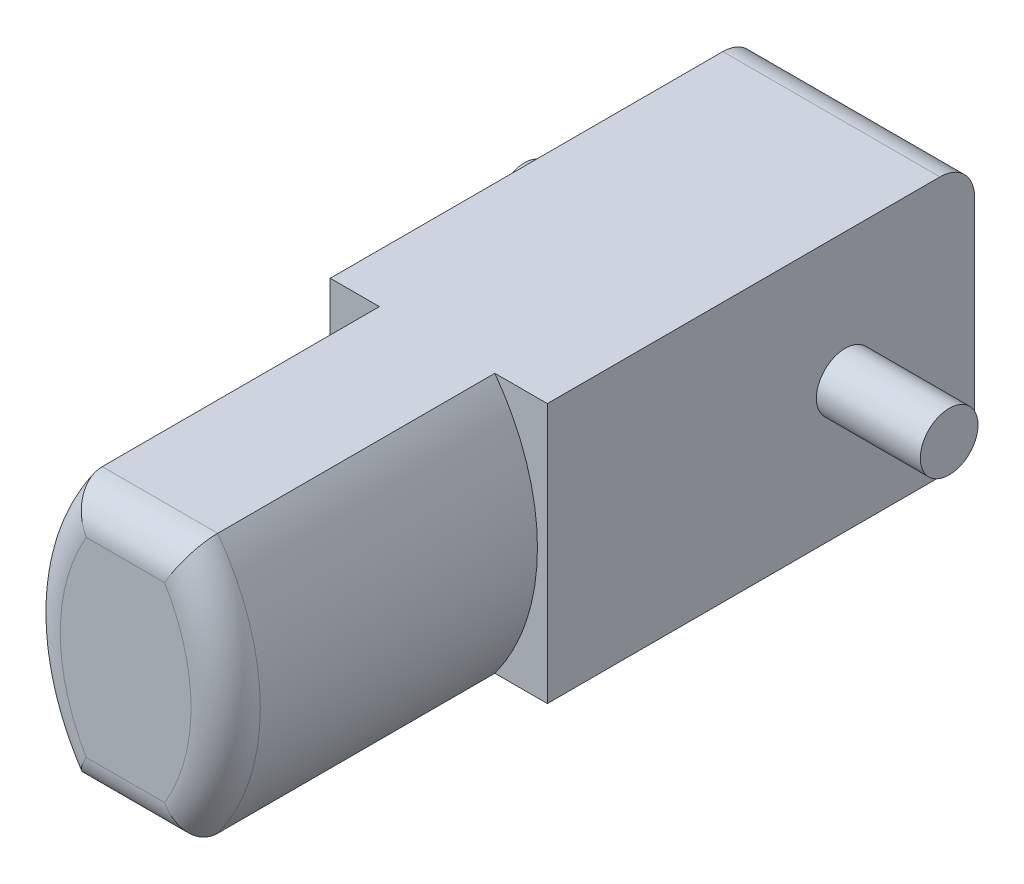
ISO-10303-21;
HEADER;
FILE_DESCRIPTION(('STEP AP214'),'2;1');
FILE_NAME('part.step','',(''),(''),'','','');
FILE_SCHEMA(('AUTOMOTIVE_DESIGN { 1 0 10303 214 1 1 1 1 }'));
ENDSEC;
DATA;
#1=APPLICATION_CONTEXT('core data for automotive mechanical design processes');
#2=APPLICATION_PROTOCOL_DEFINITION('international standard','automotive_design',2000,#1);
#3=PRODUCT_CONTEXT('',#1,'mechanical');
#4=PRODUCT('Part','Part','',(#3));
#5=PRODUCT_RELATED_PRODUCT_CATEGORY('part','',(#4));
#6=PRODUCT_DEFINITION_FORMATION('','',#4);
#7=PRODUCT_DEFINITION_CONTEXT('part definition',#1,'design');
#8=PRODUCT_DEFINITION('design','',#6,#7);
#9=PRODUCT_DEFINITION_SHAPE('','',#8);
#10=(LENGTH_UNIT() NAMED_UNIT(*) SI_UNIT(.MILLI.,.METRE.));
#11=(NAMED_UNIT(*) PLANE_ANGLE_UNIT() SI_UNIT($,.RADIAN.));
#12=(NAMED_UNIT(*) SI_UNIT($,.STERADIAN.) SOLID_ANGLE_UNIT());
#13=UNCERTAINTY_MEASURE_WITH_UNIT(LENGTH_MEASURE(1.E-05),#10,'distance_accuracy_value','');
#14=(GEOMETRIC_REPRESENTATION_CONTEXT(3) GLOBAL_UNCERTAINTY_ASSIGNED_CONTEXT((#13)) GLOBAL_UNIT_ASSIGNED_CONTEXT((#10,
#11,#12)) REPRESENTATION_CONTEXT('',''));
#15=CARTESIAN_POINT('',(0.,0.,0.));
#16=DIRECTION('',(0.,0.,1.));
#17=DIRECTION('',(1.,0.,0.));
#18=AXIS2_PLACEMENT_3D('',#15,#16,#17);
#19=CARTESIAN_POINT('',(0.,0.,37.));
#20=DIRECTION('',(0.,0.,1.));
#21=DIRECTION('',(1.,0.,0.));
#22=AXIS2_PLACEMENT_3D('',#19,#20,#21);
#23=PLANE('',#22);
#24=CARTESIAN_POINT('',(19.8648834599474,11.25,37.));
#25=DIRECTION('',(0.,0.,1.));
#26=DIRECTION('',(1.,0.,0.));
#27=AXIS2_PLACEMENT_3D('',#24,#25,#26);
#28=CIRCLE('',#27,19.2408791543178);
#29=CARTESIAN_POINT('',(4.25562560984243,22.5,37.));
#30=VERTEX_POINT('',#29);
#31=CARTESIAN_POINT('',(4.25562560984242,0.,37.));
#32=VERTEX_POINT('',#31);
#33=EDGE_CURVE('E157',#30,#32,#28,.T.);
#34=ORIENTED_EDGE('',*,*,#33,.F.);
#35=DIRECTION('',(1.,0.,0.));
#36=VECTOR('',#35,1.);
#37=CARTESIAN_POINT('',(0.,22.5,37.));
#38=LINE('',#37,#36);
#39=CARTESIAN_POINT('',(0.,22.5,37.));
#40=VERTEX_POINT('',#39);
#41=EDGE_CURVE('E152',#40,#30,#38,.T.);
#42=ORIENTED_EDGE('',*,*,#41,.F.);
#43=DIRECTION('',(0.,1.,0.));
#44=VECTOR('',#43,1.);
#45=CARTESIAN_POINT('',(0.,0.,37.));
#46=LINE('',#45,#44);
#47=CARTESIAN_POINT('',(0.,0.,37.));
#48=VERTEX_POINT('',#47);
#49=EDGE_CURVE('E185',#48,#40,#46,.T.);
#50=ORIENTED_EDGE('',*,*,#49,.F.);
#51=DIRECTION('',(1.,0.,0.));
#52=VECTOR('',#51,1.);
#53=CARTESIAN_POINT('',(0.,0.,37.));
#54=LINE('',#53,#52);
#55=EDGE_CURVE('E181',#48,#32,#54,.T.);
#56=ORIENTED_EDGE('',*,*,#55,.T.);
#57=EDGE_LOOP('',(#34,#42,#50,#56));
#58=FACE_BOUND('',#57,.T.);
#59=ADVANCED_FACE('F41',(#58),#23,.T.);
#60=CARTESIAN_POINT('',(0.,22.5,37.));
#61=DIRECTION('',(0.,1.,0.));
#62=DIRECTION('',(0.,0.,1.));
#63=AXIS2_PLACEMENT_3D('',#60,#61,#62);
#64=PLANE('',#63);
#65=DIRECTION('',(0.,0.,-1.));
#66=VECTOR('',#65,1.);
#67=CARTESIAN_POINT('',(4.25562560984243,22.5,64.));
#68=LINE('',#67,#66);
#69=CARTESIAN_POINT('',(4.25562560984243,22.5,61.));
#70=VERTEX_POINT('',#69);
#71=EDGE_CURVE('E141',#70,#30,#68,.T.);
#72=ORIENTED_EDGE('',*,*,#71,.F.);
#73=DIRECTION('',(-1.,0.,0.));
#74=VECTOR('',#73,1.);
#75=CARTESIAN_POINT('',(0.,22.5,61.));
#76=LINE('',#75,#74);
#77=CARTESIAN_POINT('',(14.2556256098424,22.5,61.));
#78=VERTEX_POINT('',#77);
#79=EDGE_CURVE('E68',#70,#78,#76,.F.);
#80=ORIENTED_EDGE('',*,*,#79,.T.);
#81=DIRECTION('',(0.,0.,-1.));
#82=VECTOR('',#81,1.);
#83=CARTESIAN_POINT('',(14.2556256098424,22.5,64.));
#84=LINE('',#83,#82);
#85=CARTESIAN_POINT('',(14.2556256098424,22.5,37.));
#86=VERTEX_POINT('',#85);
#87=EDGE_CURVE('E132',#78,#86,#84,.T.);
#88=ORIENTED_EDGE('',*,*,#87,.T.);
#89=CARTESIAN_POINT('',(18.8,22.5,37.));
#90=VERTEX_POINT('',#89);
#91=EDGE_CURVE('E136',#86,#90,#38,.T.);
#92=ORIENTED_EDGE('',*,*,#91,.T.);
#93=DIRECTION('',(0.,0.,-1.));
#94=VECTOR('',#93,1.);
#95=CARTESIAN_POINT('',(18.8,22.5,37.));
#96=LINE('',#95,#94);
#97=CARTESIAN_POINT('',(18.8,22.5,3.));
#98=VERTEX_POINT('',#97);
#99=EDGE_CURVE('E189',#90,#98,#96,.T.);
#100=ORIENTED_EDGE('',*,*,#99,.T.);
#101=DIRECTION('',(1.,0.,0.));
#102=VECTOR('',#101,1.);
#103=CARTESIAN_POINT('',(0.,22.5,3.));
#104=LINE('',#103,#102);
#105=CARTESIAN_POINT('',(0.,22.5,3.));
#106=VERTEX_POINT('',#105);
#107=EDGE_CURVE('E233',#98,#106,#104,.F.);
#108=ORIENTED_EDGE('',*,*,#107,.T.);
#109=DIRECTION('',(0.,0.,-1.));
#110=VECTOR('',#109,1.);
#111=CARTESIAN_POINT('',(0.,22.5,37.));
#112=LINE('',#111,#110);
#113=EDGE_CURVE('E196',#40,#106,#112,.T.);
#114=ORIENTED_EDGE('',*,*,#113,.F.);
#115=ORIENTED_EDGE('',*,*,#41,.T.);
#116=EDGE_LOOP('',(#72,#80,#88,#92,#100,#108,#114,#115));
#117=FACE_BOUND('',#116,.T.);
#118=ADVANCED_FACE('F134',(#117),#64,.T.);
#119=CARTESIAN_POINT('',(0.,0.,37.));
#120=DIRECTION('',(-1.,0.,0.));
#121=DIRECTION('',(0.,0.,1.));
#122=AXIS2_PLACEMENT_3D('',#119,#120,#121);
#123=PLANE('',#122);
#124=CARTESIAN_POINT('',(0.,11.25,11.2));
#125=DIRECTION('',(-1.,0.,0.));
#126=DIRECTION('',(0.,0.,1.));
#127=AXIS2_PLACEMENT_3D('',#124,#125,#126);
#128=CIRCLE('',#127,2.5);
#129=CARTESIAN_POINT('',(0.,11.25,13.7));
#130=VERTEX_POINT('',#129);
#131=EDGE_CURVE('E11',#130,#130,#128,.T.);
#132=ORIENTED_EDGE('',*,*,#131,.F.);
#133=EDGE_LOOP('',(#132));
#134=FACE_BOUND('',#133,.T.);
#135=DIRECTION('',(0.,1.,0.));
#136=VECTOR('',#135,1.);
#137=CARTESIAN_POINT('',(0.,0.,0.));
#138=LINE('',#137,#136);
#139=CARTESIAN_POINT('',(0.,3.,0.));
#140=VERTEX_POINT('',#139);
#141=CARTESIAN_POINT('',(0.,19.5,0.));
#142=VERTEX_POINT('',#141);
#143=EDGE_CURVE('E153',#140,#142,#138,.T.);
#144=ORIENTED_EDGE('',*,*,#143,.F.);
#145=CARTESIAN_POINT('',(0.,3.,3.));
#146=DIRECTION('',(-1.,0.,0.));
#147=DIRECTION('',(0.,0.,1.));
#148=AXIS2_PLACEMENT_3D('',#145,#146,#147);
#149=CIRCLE('',#148,3.);
#150=CARTESIAN_POINT('',(0.,0.,3.));
#151=VERTEX_POINT('',#150);
#152=EDGE_CURVE('E230',#140,#151,#149,.T.);
#153=ORIENTED_EDGE('',*,*,#152,.T.);
#154=DIRECTION('',(0.,0.,-1.));
#155=VECTOR('',#154,1.);
#156=CARTESIAN_POINT('',(0.,0.,37.));
#157=LINE('',#156,#155);
#158=EDGE_CURVE('E201',#48,#151,#157,.T.);
#159=ORIENTED_EDGE('',*,*,#158,.F.);
#160=ORIENTED_EDGE('',*,*,#49,.T.);
#161=ORIENTED_EDGE('',*,*,#113,.T.);
#162=CARTESIAN_POINT('',(0.,19.5,3.));
#163=DIRECTION('',(-1.,0.,0.));
#164=DIRECTION('',(0.,0.,1.));
#165=AXIS2_PLACEMENT_3D('',#162,#163,#164);
#166=CIRCLE('',#165,3.);
#167=EDGE_CURVE('E227',#106,#142,#166,.T.);
#168=ORIENTED_EDGE('',*,*,#167,.T.);
#169=EDGE_LOOP('',(#144,#153,#159,#160,#161,#168));
#170=FACE_BOUND('',#169,.T.);
#171=ADVANCED_FACE('F315',(#134,#170),#123,.T.);
#172=CARTESIAN_POINT('',(0.,0.,37.));
#173=DIRECTION('',(0.,1.,0.));
#174=DIRECTION('',(0.,0.,1.));
#175=AXIS2_PLACEMENT_3D('',#172,#173,#174);
#176=PLANE('',#175);
#177=DIRECTION('',(0.,0.,-1.));
#178=VECTOR('',#177,1.);
#179=CARTESIAN_POINT('',(14.2556256098424,0.,64.));
#180=LINE('',#179,#178);
#181=CARTESIAN_POINT('',(14.2556256098424,0.,61.));
#182=VERTEX_POINT('',#181);
#183=CARTESIAN_POINT('',(14.2556256098424,0.,37.));
#184=VERTEX_POINT('',#183);
#185=EDGE_CURVE('E140',#182,#184,#180,.T.);
#186=ORIENTED_EDGE('',*,*,#185,.F.);
#187=DIRECTION('',(1.,0.,0.));
#188=VECTOR('',#187,1.);
#189=CARTESIAN_POINT('',(4.25562560984243,0.,61.));
#190=LINE('',#189,#188);
#191=CARTESIAN_POINT('',(4.25562560984243,0.,61.));
#192=VERTEX_POINT('',#191);
#193=EDGE_CURVE('E52',#182,#192,#190,.F.);
#194=ORIENTED_EDGE('',*,*,#193,.T.);
#195=DIRECTION('',(0.,0.,-1.));
#196=VECTOR('',#195,1.);
#197=CARTESIAN_POINT('',(4.25562560984243,0.,64.));
#198=LINE('',#197,#196);
#199=EDGE_CURVE('E163',#192,#32,#198,.T.);
#200=ORIENTED_EDGE('',*,*,#199,.T.);
#201=ORIENTED_EDGE('',*,*,#55,.F.);
#202=ORIENTED_EDGE('',*,*,#158,.T.);
#203=DIRECTION('',(1.,0.,0.));
#204=VECTOR('',#203,1.);
#205=CARTESIAN_POINT('',(0.,0.,3.));
#206=LINE('',#205,#204);
#207=CARTESIAN_POINT('',(18.8,0.,3.));
#208=VERTEX_POINT('',#207);
#209=EDGE_CURVE('E200',#151,#208,#206,.T.);
#210=ORIENTED_EDGE('',*,*,#209,.T.);
#211=DIRECTION('',(0.,0.,-1.));
#212=VECTOR('',#211,1.);
#213=CARTESIAN_POINT('',(18.8,0.,37.));
#214=LINE('',#213,#212);
#215=CARTESIAN_POINT('',(18.8,0.,37.));
#216=VERTEX_POINT('',#215);
#217=EDGE_CURVE('E205',#216,#208,#214,.T.);
#218=ORIENTED_EDGE('',*,*,#217,.F.);
#219=EDGE_CURVE('E180',#184,#216,#54,.T.);
#220=ORIENTED_EDGE('',*,*,#219,.F.);
#221=EDGE_LOOP('',(#186,#194,#200,#201,#202,#210,#218,#220));
#222=FACE_BOUND('',#221,.T.);
#223=ADVANCED_FACE('F321',(#222),#176,.F.);
#224=CARTESIAN_POINT('',(18.8,0.,37.));
#225=DIRECTION('',(-1.,0.,0.));
#226=DIRECTION('',(0.,0.,1.));
#227=AXIS2_PLACEMENT_3D('',#224,#225,#226);
#228=PLANE('',#227);
#229=CARTESIAN_POINT('',(18.8,11.25,11.2));
#230=DIRECTION('',(-1.,0.,0.));
#231=DIRECTION('',(0.,0.,1.));
#232=AXIS2_PLACEMENT_3D('',#229,#230,#231);
#233=CIRCLE('',#232,2.5);
#234=CARTESIAN_POINT('',(18.8,11.25,13.7));
#235=VERTEX_POINT('',#234);
#236=EDGE_CURVE('E46',#235,#235,#233,.T.);
#237=ORIENTED_EDGE('',*,*,#236,.T.);
#238=EDGE_LOOP('',(#237));
#239=FACE_BOUND('',#238,.T.);
#240=ORIENTED_EDGE('',*,*,#217,.T.);
#241=CARTESIAN_POINT('',(18.8,3.,3.));
#242=DIRECTION('',(-1.,0.,0.));
#243=DIRECTION('',(0.,0.,1.));
#244=AXIS2_PLACEMENT_3D('',#241,#242,#243);
#245=CIRCLE('',#244,3.);
#246=CARTESIAN_POINT('',(18.8,3.,0.));
#247=VERTEX_POINT('',#246);
#248=EDGE_CURVE('E217',#208,#247,#245,.F.);
#249=ORIENTED_EDGE('',*,*,#248,.T.);
#250=DIRECTION('',(0.,1.,0.));
#251=VECTOR('',#250,1.);
#252=CARTESIAN_POINT('',(18.8,0.,0.));
#253=LINE('',#252,#251);
#254=CARTESIAN_POINT('',(18.8,19.5,0.));
#255=VERTEX_POINT('',#254);
#256=EDGE_CURVE('E174',#247,#255,#253,.T.);
#257=ORIENTED_EDGE('',*,*,#256,.T.);
#258=CARTESIAN_POINT('',(18.8,19.5,3.));
#259=DIRECTION('',(-1.,0.,0.));
#260=DIRECTION('',(0.,0.,1.));
#261=AXIS2_PLACEMENT_3D('',#258,#259,#260);
#262=CIRCLE('',#261,3.);
#263=EDGE_CURVE('E214',#255,#98,#262,.F.);
#264=ORIENTED_EDGE('',*,*,#263,.T.);
#265=ORIENTED_EDGE('',*,*,#99,.F.);
#266=DIRECTION('',(0.,1.,0.));
#267=VECTOR('',#266,1.);
#268=CARTESIAN_POINT('',(18.8,0.,37.));
#269=LINE('',#268,#267);
#270=EDGE_CURVE('E149',#216,#90,#269,.T.);
#271=ORIENTED_EDGE('',*,*,#270,.F.);
#272=EDGE_LOOP('',(#240,#249,#257,#264,#265,#271));
#273=FACE_BOUND('',#272,.T.);
#274=ADVANCED_FACE('F342',(#239,#273),#228,.F.);
#275=CARTESIAN_POINT('',(-1.06,11.25,37.));
#276=DIRECTION('',(0.,0.,1.));
#277=DIRECTION('',(1.,0.,0.));
#278=AXIS2_PLACEMENT_3D('',#275,#276,#277);
#279=CIRCLE('',#278,19.0034441041844);
#280=EDGE_CURVE('E146',#184,#86,#279,.T.);
#281=ORIENTED_EDGE('',*,*,#280,.F.);
#282=ORIENTED_EDGE('',*,*,#219,.T.);
#283=ORIENTED_EDGE('',*,*,#270,.T.);
#284=ORIENTED_EDGE('',*,*,#91,.F.);
#285=EDGE_LOOP('',(#281,#282,#283,#284));
#286=FACE_BOUND('',#285,.T.);
#287=ADVANCED_FACE('F145',(#286),#23,.T.);
#288=CARTESIAN_POINT('',(0.,0.,0.));
#289=DIRECTION('',(0.,0.,1.));
#290=DIRECTION('',(1.,0.,0.));
#291=AXIS2_PLACEMENT_3D('',#288,#289,#290);
#292=PLANE('',#291);
#293=ORIENTED_EDGE('',*,*,#256,.F.);
#294=DIRECTION('',(1.,0.,0.));
#295=VECTOR('',#294,1.);
#296=CARTESIAN_POINT('',(0.,3.,0.));
#297=LINE('',#296,#295);
#298=EDGE_CURVE('E224',#247,#140,#297,.F.);
#299=ORIENTED_EDGE('',*,*,#298,.T.);
#300=ORIENTED_EDGE('',*,*,#143,.T.);
#301=DIRECTION('',(1.,0.,0.));
#302=VECTOR('',#301,1.);
#303=CARTESIAN_POINT('',(18.8,19.5,0.));
#304=LINE('',#303,#302);
#305=EDGE_CURVE('E220',#142,#255,#304,.T.);
#306=ORIENTED_EDGE('',*,*,#305,.T.);
#307=EDGE_LOOP('',(#293,#299,#300,#306));
#308=FACE_BOUND('',#307,.T.);
#309=ADVANCED_FACE('F341',(#308),#292,.F.);
#310=CARTESIAN_POINT('',(0.,3.,3.));
#311=DIRECTION('',(1.,0.,0.));
#312=DIRECTION('',(0.,0.,-1.));
#313=AXIS2_PLACEMENT_3D('',#310,#311,#312);
#314=CYLINDRICAL_SURFACE('',#313,3.);
#315=ORIENTED_EDGE('',*,*,#152,.F.);
#316=ORIENTED_EDGE('',*,*,#298,.F.);
#317=ORIENTED_EDGE('',*,*,#248,.F.);
#318=ORIENTED_EDGE('',*,*,#209,.F.);
#319=EDGE_LOOP('',(#315,#316,#317,#318));
#320=FACE_BOUND('',#319,.T.);
#321=ADVANCED_FACE('F347',(#320),#314,.T.);
#322=CARTESIAN_POINT('',(0.,19.5,3.));
#323=DIRECTION('',(-1.,0.,0.));
#324=DIRECTION('',(0.,0.,1.));
#325=AXIS2_PLACEMENT_3D('',#322,#323,#324);
#326=CYLINDRICAL_SURFACE('',#325,3.);
#327=ORIENTED_EDGE('',*,*,#167,.F.);
#328=ORIENTED_EDGE('',*,*,#107,.F.);
#329=ORIENTED_EDGE('',*,*,#263,.F.);
#330=ORIENTED_EDGE('',*,*,#305,.F.);
#331=EDGE_LOOP('',(#327,#328,#329,#330));
#332=FACE_BOUND('',#331,.T.);
#333=ADVANCED_FACE('F362',(#332),#326,.T.);
#334=CARTESIAN_POINT('',(-1.06,11.25,64.));
#335=DIRECTION('',(0.,0.,-1.));
#336=DIRECTION('',(-1.,0.,0.));
#337=AXIS2_PLACEMENT_3D('',#334,#335,#336);
#338=CYLINDRICAL_SURFACE('',#337,19.0034441041844);
#339=ORIENTED_EDGE('',*,*,#87,.F.);
#340=CARTESIAN_POINT('',(-1.06,11.25,61.));
#341=DIRECTION('',(0.,0.,1.));
#342=DIRECTION('',(1.,0.,0.));
#343=AXIS2_PLACEMENT_3D('',#340,#341,#342);
#344=CIRCLE('',#343,19.0034441041844);
#345=EDGE_CURVE('E60',#78,#182,#344,.F.);
#346=ORIENTED_EDGE('',*,*,#345,.T.);
#347=ORIENTED_EDGE('',*,*,#185,.T.);
#348=ORIENTED_EDGE('',*,*,#280,.T.);
#349=EDGE_LOOP('',(#339,#346,#347,#348));
#350=FACE_BOUND('',#349,.T.);
#351=ADVANCED_FACE('F155',(#350),#338,.T.);
#352=CARTESIAN_POINT('',(19.8648834599474,11.25,64.));
#353=DIRECTION('',(0.,0.,-1.));
#354=DIRECTION('',(-1.,0.,0.));
#355=AXIS2_PLACEMENT_3D('',#352,#353,#354);
#356=CYLINDRICAL_SURFACE('',#355,19.2408791543178);
#357=ORIENTED_EDGE('',*,*,#199,.F.);
#358=CARTESIAN_POINT('',(19.8648834599474,11.25,61.));
#359=DIRECTION('',(0.,0.,1.));
#360=DIRECTION('',(1.,0.,0.));
#361=AXIS2_PLACEMENT_3D('',#358,#359,#360);
#362=CIRCLE('',#361,19.2408791543178);
#363=EDGE_CURVE('E249',#192,#70,#362,.F.);
#364=ORIENTED_EDGE('',*,*,#363,.T.);
#365=ORIENTED_EDGE('',*,*,#71,.T.);
#366=ORIENTED_EDGE('',*,*,#33,.T.);
#367=EDGE_LOOP('',(#357,#364,#365,#366));
#368=FACE_BOUND('',#367,.T.);
#369=ADVANCED_FACE('F308',(#368),#356,.T.);
#370=CARTESIAN_POINT('',(0.,0.,64.));
#371=DIRECTION('',(0.,0.,1.));
#372=DIRECTION('',(1.,0.,0.));
#373=AXIS2_PLACEMENT_3D('',#370,#371,#372);
#374=PLANE('',#373);
#375=DIRECTION('',(-1.,0.,0.));
#376=VECTOR('',#375,1.);
#377=CARTESIAN_POINT('',(0.,19.5,64.));
#378=LINE('',#377,#376);
#379=CARTESIAN_POINT('',(12.6530493762604,19.5,64.));
#380=VERTEX_POINT('',#379);
#381=CARTESIAN_POINT('',(5.8754711883344,19.5,64.));
#382=VERTEX_POINT('',#381);
#383=EDGE_CURVE('E242',#380,#382,#378,.T.);
#384=ORIENTED_EDGE('',*,*,#383,.T.);
#385=CARTESIAN_POINT('',(19.8648834599474,11.25,64.));
#386=DIRECTION('',(0.,0.,1.));
#387=DIRECTION('',(1.,0.,0.));
#388=AXIS2_PLACEMENT_3D('',#385,#386,#387);
#389=CIRCLE('',#388,16.2408791543178);
#390=CARTESIAN_POINT('',(5.87547118833439,3.,64.));
#391=VERTEX_POINT('',#390);
#392=EDGE_CURVE('E245',#382,#391,#389,.T.);
#393=ORIENTED_EDGE('',*,*,#392,.T.);
#394=DIRECTION('',(1.,0.,0.));
#395=VECTOR('',#394,1.);
#396=CARTESIAN_POINT('',(14.2556256098424,3.,64.));
#397=LINE('',#396,#395);
#398=CARTESIAN_POINT('',(12.6530493762604,3.,64.));
#399=VERTEX_POINT('',#398);
#400=EDGE_CURVE('E236',#391,#399,#397,.T.);
#401=ORIENTED_EDGE('',*,*,#400,.T.);
#402=CARTESIAN_POINT('',(-1.06,11.25,64.));
#403=DIRECTION('',(0.,0.,1.));
#404=DIRECTION('',(1.,0.,0.));
#405=AXIS2_PLACEMENT_3D('',#402,#403,#404);
#406=CIRCLE('',#405,16.0034441041844);
#407=EDGE_CURVE('E239',#399,#380,#406,.T.);
#408=ORIENTED_EDGE('',*,*,#407,.T.);
#409=EDGE_LOOP('',(#384,#393,#401,#408));
#410=FACE_BOUND('',#409,.T.);
#411=ADVANCED_FACE('F324',(#410),#374,.T.);
#412=CARTESIAN_POINT('',(-1.06,11.25,61.));
#413=DIRECTION('',(0.,0.,1.));
#414=DIRECTION('',(1.,0.,0.));
#415=AXIS2_PLACEMENT_3D('',#412,#413,#414);
#416=TOROIDAL_SURFACE('',#415,16.0034441041844,3.);
#417=CARTESIAN_POINT('',(14.2556256098424,0.,61.));
#418=CARTESIAN_POINT('',(14.2556307993696,-1.21297341909825E-05,61.0776926413416));
#419=CARTESIAN_POINT('',(14.2540978443711,0.00301779681776747,61.1553788452683));
#420=CARTESIAN_POINT('',(14.2479957241066,0.0150689000052142,61.3101458514865));
#421=CARTESIAN_POINT('',(14.2434273328152,0.0240885493827637,61.3872268030369));
#422=CARTESIAN_POINT('',(14.2313150884543,0.0479854684127316,61.5399698340952));
#423=CARTESIAN_POINT('',(14.2237814450587,0.062842638563725,61.615635858689));
#424=CARTESIAN_POINT('',(14.2058211832511,0.0982254774250978,61.7652603917151));
#425=CARTESIAN_POINT('',(14.1953944850646,0.118751302445827,61.8392188530011));
#426=CARTESIAN_POINT('',(14.1599239338524,0.188488464012582,62.057685671185));
#427=CARTESIAN_POINT('',(14.1306718858884,0.245894662372869,62.1990059766847));
#428=CARTESIAN_POINT('',(14.0620102798178,0.380112662085482,62.4693648353754));
#429=CARTESIAN_POINT('',(14.0225949320598,0.456935523888903,62.5983963305306));
#430=CARTESIAN_POINT('',(13.9330775017135,0.630564469589995,62.8465097701834));
#431=CARTESIAN_POINT('',(13.8826096897179,0.728049398600006,62.9649837106666));
#432=CARTESIAN_POINT('',(13.7735029677644,0.937554480181293,63.1838727918787));
#433=CARTESIAN_POINT('',(13.7148619467342,1.04957838753399,63.2842832515619));
#434=CARTESIAN_POINT('',(13.584552566453,1.29685108624483,63.4750915883673));
#435=CARTESIAN_POINT('',(13.5121660029228,1.43330313228789,63.5634369997369));
#436=CARTESIAN_POINT('',(13.3610242297621,1.71589321539271,63.7160439012035));
#437=CARTESIAN_POINT('',(13.2822634302059,1.86203973337609,63.7802839675589));
#438=CARTESIAN_POINT('',(13.1147002976281,2.1702444514005,63.8878910356783));
#439=CARTESIAN_POINT('',(13.0255786953911,2.3327129987171,63.9295737162172));
#440=CARTESIAN_POINT('',(12.8441257279046,2.66022934922854,63.985308793218));
#441=CARTESIAN_POINT('',(12.7518012546713,2.82527123891318,63.9994171760891));
#442=CARTESIAN_POINT('',(12.6569319874604,2.99313233618418,63.9999941152385));
#443=CARTESIAN_POINT('',(12.6549908086265,2.99656631164993,64.0000000107584));
#444=CARTESIAN_POINT('',(12.6530493762604,3.,64.));
#445=B_SPLINE_CURVE_WITH_KNOTS('',3,(#417,#418,#419,#420,#421,#422,#423,#424,#425,#426,#427,
#428,#429,#430,#431,#432,#433,#434,#435,#436,#437,#438,#439,#440,#441,#442,#443,#444),
.UNSPECIFIED.,.F.,.F.,(4,2,2,2,2,2,2,2,2,2,2,2,2,4),(0.,0.232992848978928,0.465926312301886,
0.698064680157776,0.930209449753395,1.3938355088807,1.85772626417287,2.34025428793064,
2.82290717644436,3.35457687724048,3.88671798912587,4.4544665593535,5.02106117957321,
5.03289515923986),.UNSPECIFIED.);
#446=EDGE_CURVE('E166',#182,#399,#445,.T.);
#447=ORIENTED_EDGE('',*,*,#446,.F.);
#448=ORIENTED_EDGE('',*,*,#345,.F.);
#449=CARTESIAN_POINT('',(14.2556256098424,22.5,61.));
#450=CARTESIAN_POINT('',(14.2556307993696,22.5000121297342,61.0776926413416));
#451=CARTESIAN_POINT('',(14.2540978443711,22.4969822031822,61.1553788452683));
#452=CARTESIAN_POINT('',(14.2479957241066,22.4849310999948,61.3101458514865));
#453=CARTESIAN_POINT('',(14.2434273328152,22.4759114506172,61.3872268030369));
#454=CARTESIAN_POINT('',(14.2313150884542,22.4520145315873,61.5399698340952));
#455=CARTESIAN_POINT('',(14.2237814450587,22.4371573614363,61.615635858689));
#456=CARTESIAN_POINT('',(14.2058211832511,22.4017745225749,61.7652603917151));
#457=CARTESIAN_POINT('',(14.1953944850646,22.3812486975542,61.8392188530011));
#458=CARTESIAN_POINT('',(14.1599239338524,22.3115115359874,62.057685671185));
#459=CARTESIAN_POINT('',(14.1306718858883,22.2541053376271,62.1990059766847));
#460=CARTESIAN_POINT('',(14.0620102798178,22.1198873379145,62.4693648353754));
#461=CARTESIAN_POINT('',(14.0225949320597,22.0430644761111,62.5983963305306));
#462=CARTESIAN_POINT('',(13.9330775017135,21.86943553041,62.8465097701834));
#463=CARTESIAN_POINT('',(13.8826096897179,21.7719506014,62.9649837106666));
#464=CARTESIAN_POINT('',(13.7735029677643,21.5624455198187,63.1838727918787));
#465=CARTESIAN_POINT('',(13.7148619467342,21.450421612466,63.2842832515619));
#466=CARTESIAN_POINT('',(13.584552566453,21.2031489137552,63.4750915883673));
#467=CARTESIAN_POINT('',(13.5121660029228,21.0666968677121,63.5634369997369));
#468=CARTESIAN_POINT('',(13.361024229762,20.7841067846073,63.7160439012035));
#469=CARTESIAN_POINT('',(13.2822634302058,20.6379602666239,63.7802839675589));
#470=CARTESIAN_POINT('',(13.1147002976282,20.3297555485995,63.8878910356783));
#471=CARTESIAN_POINT('',(13.0255786953912,20.1672870012828,63.9295737162172));
#472=CARTESIAN_POINT('',(12.8441257279044,19.8397706507715,63.985308793218));
#473=CARTESIAN_POINT('',(12.7518012546709,19.6747287610871,63.9994171760891));
#474=CARTESIAN_POINT('',(12.6569319874603,19.5068676638158,63.9999941152385));
#475=CARTESIAN_POINT('',(12.6549908086265,19.5034336883501,64.0000000107584));
#476=CARTESIAN_POINT('',(12.6530493762604,19.5,64.));
#477=B_SPLINE_CURVE_WITH_KNOTS('',3,(#449,#450,#451,#452,#453,#454,#455,#456,#457,#458,#459,
#460,#461,#462,#463,#464,#465,#466,#467,#468,#469,#470,#471,#472,#473,#474,#475,#476),
.UNSPECIFIED.,.F.,.F.,(4,2,2,2,2,2,2,2,2,2,2,2,2,4),(0.,0.232992848978928,0.465926312301887,
0.698064680157776,0.930209449753389,1.3938355088807,1.85772626417287,2.34025428793064,
2.82290717644436,3.35457687724047,3.88671798912585,4.45446655935348,5.02106117957321,
5.03289515923985),.UNSPECIFIED.);
#478=EDGE_CURVE('E158',#380,#78,#477,.F.);
#479=ORIENTED_EDGE('',*,*,#478,.F.);
#480=ORIENTED_EDGE('',*,*,#407,.F.);
#481=EDGE_LOOP('',(#447,#448,#479,#480));
#482=FACE_BOUND('',#481,.T.);
#483=ADVANCED_FACE('F43',(#482),#416,.T.);
#484=CARTESIAN_POINT('',(0.,19.5,61.));
#485=DIRECTION('',(-1.,0.,0.));
#486=DIRECTION('',(0.,0.,1.));
#487=AXIS2_PLACEMENT_3D('',#484,#485,#486);
#488=CYLINDRICAL_SURFACE('',#487,3.);
#489=ORIENTED_EDGE('',*,*,#478,.T.);
#490=ORIENTED_EDGE('',*,*,#79,.F.);
#491=CARTESIAN_POINT('',(4.25562560984243,22.5,61.));
#492=CARTESIAN_POINT('',(4.25562031555257,22.5000121936634,61.0775696113764));
#493=CARTESIAN_POINT('',(4.25716564891331,22.4969917582027,61.1551327307978));
#494=CARTESIAN_POINT('',(4.26331669436705,22.4849789757539,61.3096534010261));
#495=CARTESIAN_POINT('',(4.26792161294203,22.4759881772082,61.3866111036158));
#496=CARTESIAN_POINT('',(4.28012980797536,22.4521692559433,61.5391045673651));
#497=CARTESIAN_POINT('',(4.28772264186917,22.4373614635394,61.6146443309841));
#498=CARTESIAN_POINT('',(4.30582271438758,22.402098339113,61.7640177790791));
#499=CARTESIAN_POINT('',(4.31633003589027,22.3816428464894,61.8378514149739));
#500=CARTESIAN_POINT('',(4.35207141494319,22.3121503337054,62.0559445195728));
#501=CARTESIAN_POINT('',(4.38154303405097,22.2549516943547,62.1970195699634));
#502=CARTESIAN_POINT('',(4.45070545557727,22.1212409315799,62.4669160370725));
#503=CARTESIAN_POINT('',(4.49040224080613,22.044717501612,62.5957302192426));
#504=CARTESIAN_POINT('',(4.58056962959679,21.8717342799133,62.8435338420865));
#505=CARTESIAN_POINT('',(4.63141424470435,21.7745875225285,62.9619065977876));
#506=CARTESIAN_POINT('',(4.74131577021875,21.5658318526953,63.1806481286459));
#507=CARTESIAN_POINT('',(4.80037478566022,21.4542192337045,63.2810122737438));
#508=CARTESIAN_POINT('',(4.93171159091781,21.2076486532223,63.4719823156545));
#509=CARTESIAN_POINT('',(5.00472484918133,21.0714700759023,63.5605037145246));
#510=CARTESIAN_POINT('',(5.15716156026701,20.7894458911558,63.7135042376416));
#511=CARTESIAN_POINT('',(5.23659077797928,20.6435916113924,63.7779614406685));
#512=CARTESIAN_POINT('',(5.40625180330082,20.33474224822,63.8865189529634));
#513=CARTESIAN_POINT('',(5.49684665392243,20.1712835573225,63.9287203611047));
#514=CARTESIAN_POINT('',(5.68130277645601,19.8417538619974,63.9851409327356));
#515=CARTESIAN_POINT('',(5.77515703711364,19.6756888405516,63.999416780503));
#516=CARTESIAN_POINT('',(5.87156869795792,19.5068326915459,63.9999941748292));
#517=CARTESIAN_POINT('',(5.87351981869691,19.5034162031282,64.0000000104474));
#518=CARTESIAN_POINT('',(5.87547118833439,19.5,64.));
#519=B_SPLINE_CURVE_WITH_KNOTS('',3,(#491,#492,#493,#494,#495,#496,#497,#498,#499,#500,#501,
#502,#503,#504,#505,#506,#507,#508,#509,#510,#511,#512,#513,#514,#515,#516,#517,#518),
.UNSPECIFIED.,.F.,.F.,(4,2,2,2,2,2,2,2,2,2,2,2,2,4),(0.,0.232623681866513,0.465187055209078,
0.696944752506172,0.928709040877288,1.39156548446712,1.85469336595904,2.33674887734831,
2.81892814939648,3.35100339670967,3.88356216079985,4.45623232242655,5.02773884696579,
5.03954194829288),.UNSPECIFIED.);
#520=EDGE_CURVE('E268',#382,#70,#519,.F.);
#521=ORIENTED_EDGE('',*,*,#520,.F.);
#522=ORIENTED_EDGE('',*,*,#383,.F.);
#523=EDGE_LOOP('',(#489,#490,#521,#522));
#524=FACE_BOUND('',#523,.T.);
#525=ADVANCED_FACE('F280',(#524),#488,.T.);
#526=CARTESIAN_POINT('',(0.,3.,61.));
#527=DIRECTION('',(-1.,0.,0.));
#528=DIRECTION('',(0.,0.,1.));
#529=AXIS2_PLACEMENT_3D('',#526,#527,#528);
#530=CYLINDRICAL_SURFACE('',#529,3.);
#531=ORIENTED_EDGE('',*,*,#446,.T.);
#532=ORIENTED_EDGE('',*,*,#400,.F.);
#533=CARTESIAN_POINT('',(4.25562560984243,0.,61.));
#534=CARTESIAN_POINT('',(4.25562031555257,-1.2193663379923E-05,61.0775696113764));
#535=CARTESIAN_POINT('',(4.2571656489133,0.00300824179732377,61.1551327307978));
#536=CARTESIAN_POINT('',(4.26331669436705,0.0150210242461472,61.3096534010261));
#537=CARTESIAN_POINT('',(4.26792161294203,0.0240118227917714,61.3866111036158));
#538=CARTESIAN_POINT('',(4.28012980797535,0.0478307440566883,61.5391045673651));
#539=CARTESIAN_POINT('',(4.28772264186917,0.0626385364606432,61.6146443309841));
#540=CARTESIAN_POINT('',(4.30582271438758,0.0979016608869826,61.7640177790791));
#541=CARTESIAN_POINT('',(4.31633003589027,0.118357153510617,61.8378514149739));
#542=CARTESIAN_POINT('',(4.35207141494318,0.187849666294548,62.0559445195728));
#543=CARTESIAN_POINT('',(4.38154303405097,0.24504830564525,62.1970195699634));
#544=CARTESIAN_POINT('',(4.45070545557726,0.378759068420142,62.4669160370725));
#545=CARTESIAN_POINT('',(4.49040224080612,0.455282498387998,62.5957302192426));
#546=CARTESIAN_POINT('',(4.58056962959678,0.628265720086692,62.8435338420865));
#547=CARTESIAN_POINT('',(4.63141424470435,0.72541247747146,62.9619065977876));
#548=CARTESIAN_POINT('',(4.74131577021875,0.934168147304718,63.1806481286459));
#549=CARTESIAN_POINT('',(4.80037478566023,1.04578076629547,63.2810122737438));
#550=CARTESIAN_POINT('',(4.9317115909178,1.29235134677769,63.4719823156546));
#551=CARTESIAN_POINT('',(5.0047248491813,1.42852992409769,63.5605037145246));
#552=CARTESIAN_POINT('',(5.15716156026704,1.71055410884419,63.7135042376416));
#553=CARTESIAN_POINT('',(5.23659077797939,1.8564083886075,63.7779614406685));
#554=CARTESIAN_POINT('',(5.40625180330069,2.16525775178008,63.8865189529634));
#555=CARTESIAN_POINT('',(5.49684665392194,2.32871644267777,63.9287203611047));
#556=CARTESIAN_POINT('',(5.68130277645648,2.65824613800236,63.9851409327356));
#557=CARTESIAN_POINT('',(5.77515703711541,2.82431115944742,63.999416780503));
#558=CARTESIAN_POINT('',(5.87156869795799,2.99316730845407,63.9999941748292));
#559=CARTESIAN_POINT('',(5.87351981869694,2.99658379687183,64.0000000104474));
#560=CARTESIAN_POINT('',(5.87547118833439,3.,64.));
#561=B_SPLINE_CURVE_WITH_KNOTS('',3,(#533,#534,#535,#536,#537,#538,#539,#540,#541,#542,#543,
#544,#545,#546,#547,#548,#549,#550,#551,#552,#553,#554,#555,#556,#557,#558,#559,#560),
.UNSPECIFIED.,.F.,.F.,(4,2,2,2,2,2,2,2,2,2,2,2,2,4),(0.,0.232623681866513,0.465187055209078,
0.696944752506186,0.928709040877288,1.39156548446712,1.85469336595904,2.33674887734831,
2.81892814939649,3.35100339670969,3.88356216079985,4.45623232242654,5.02773884696579,
5.03954194829288),.UNSPECIFIED.);
#562=EDGE_CURVE('E259',#192,#391,#561,.T.);
#563=ORIENTED_EDGE('',*,*,#562,.F.);
#564=ORIENTED_EDGE('',*,*,#193,.F.);
#565=EDGE_LOOP('',(#531,#532,#563,#564));
#566=FACE_BOUND('',#565,.T.);
#567=ADVANCED_FACE('F277',(#566),#530,.T.);
#568=CARTESIAN_POINT('',(19.8648834599474,11.25,61.));
#569=DIRECTION('',(0.,0.,1.));
#570=DIRECTION('',(1.,0.,0.));
#571=AXIS2_PLACEMENT_3D('',#568,#569,#570);
#572=TOROIDAL_SURFACE('',#571,16.2408791543178,3.);
#573=ORIENTED_EDGE('',*,*,#520,.T.);
#574=ORIENTED_EDGE('',*,*,#363,.F.);
#575=ORIENTED_EDGE('',*,*,#562,.T.);
#576=ORIENTED_EDGE('',*,*,#392,.F.);
#577=EDGE_LOOP('',(#573,#574,#575,#576));
#578=FACE_BOUND('',#577,.T.);
#579=ADVANCED_FACE('F274',(#578),#572,.T.);
#580=CARTESIAN_POINT('',(27.8,11.25,11.2));
#581=DIRECTION('',(-1.,0.,0.));
#582=DIRECTION('',(0.,0.,1.));
#583=AXIS2_PLACEMENT_3D('',#580,#581,#582);
#584=PLANE('',#583);
#585=CARTESIAN_POINT('',(27.8,11.25,11.2));
#586=DIRECTION('',(-1.,0.,0.));
#587=DIRECTION('',(0.,0.,1.));
#588=AXIS2_PLACEMENT_3D('',#585,#586,#587);
#589=CIRCLE('',#588,2.5);
#590=CARTESIAN_POINT('',(27.8,11.25,13.7));
#591=VERTEX_POINT('',#590);
#592=EDGE_CURVE('E399',#591,#591,#589,.T.);
#593=ORIENTED_EDGE('',*,*,#592,.F.);
#594=EDGE_LOOP('',(#593));
#595=FACE_BOUND('',#594,.T.);
#596=ADVANCED_FACE('F386',(#595),#584,.F.);
#597=CARTESIAN_POINT('',(27.8,11.25,11.2));
#598=DIRECTION('',(-1.,0.,0.));
#599=DIRECTION('',(0.,0.,1.));
#600=AXIS2_PLACEMENT_3D('',#597,#598,#599);
#601=CYLINDRICAL_SURFACE('',#600,2.5);
#602=ORIENTED_EDGE('',*,*,#592,.T.);
#603=EDGE_LOOP('',(#602));
#604=FACE_BOUND('',#603,.T.);
#605=ORIENTED_EDGE('',*,*,#236,.F.);
#606=EDGE_LOOP('',(#605));
#607=FACE_BOUND('',#606,.T.);
#608=ADVANCED_FACE('F384',(#604,#607),#601,.T.);
#609=ORIENTED_EDGE('',*,*,#131,.T.);
#610=EDGE_LOOP('',(#609));
#611=FACE_BOUND('',#610,.T.);
#612=CARTESIAN_POINT('',(-9.,11.25,11.2));
#613=DIRECTION('',(-1.,0.,0.));
#614=DIRECTION('',(0.,0.,1.));
#615=AXIS2_PLACEMENT_3D('',#612,#613,#614);
#616=CIRCLE('',#615,2.5);
#617=CARTESIAN_POINT('',(-9.,11.25,13.7));
#618=VERTEX_POINT('',#617);
#619=EDGE_CURVE('E396',#618,#618,#616,.T.);
#620=ORIENTED_EDGE('',*,*,#619,.F.);
#621=EDGE_LOOP('',(#620));
#622=FACE_BOUND('',#621,.T.);
#623=ADVANCED_FACE('F380',(#611,#622),#601,.T.);
#624=CARTESIAN_POINT('',(-9.,11.25,11.2));
#625=DIRECTION('',(-1.,0.,0.));
#626=DIRECTION('',(0.,0.,1.));
#627=AXIS2_PLACEMENT_3D('',#624,#625,#626);
#628=PLANE('',#627);
#629=ORIENTED_EDGE('',*,*,#619,.T.);
#630=EDGE_LOOP('',(#629));
#631=FACE_BOUND('',#630,.T.);
#632=ADVANCED_FACE('F383',(#631),#628,.T.);
#633=CLOSED_SHELL('',(#59,#118,#171,#223,#274,#287,#309,#321,#333,#351,#369,#411,#483,#525,#567,
#579,#596,#608,#623,#632));
#634=MANIFOLD_SOLID_BREP('B2',#633);
#635=ADVANCED_BREP_SHAPE_REPRESENTATION('',(#18,#634),#14);
#636=SHAPE_DEFINITION_REPRESENTATION(#9,#635);
ENDSEC;
END-ISO-10303-21;
